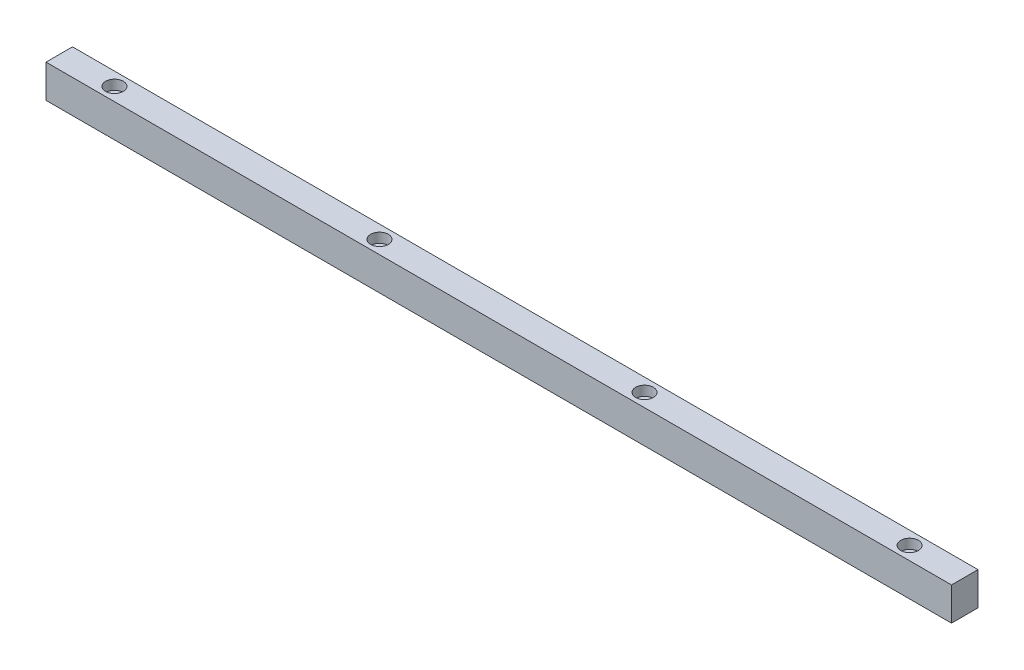
ISO-10303-21;
HEADER;
FILE_DESCRIPTION(('STEP AP214'),'2;1');
FILE_NAME('part.step','',(''),(''),'','','');
FILE_SCHEMA(('AUTOMOTIVE_DESIGN { 1 0 10303 214 1 1 1 1 }'));
ENDSEC;
DATA;
#1=APPLICATION_CONTEXT('core data for automotive mechanical design processes');
#2=APPLICATION_PROTOCOL_DEFINITION('international standard','automotive_design',2000,#1);
#3=PRODUCT_CONTEXT('',#1,'mechanical');
#4=PRODUCT('Part','Part','',(#3));
#5=PRODUCT_RELATED_PRODUCT_CATEGORY('part','',(#4));
#6=PRODUCT_DEFINITION_FORMATION('','',#4);
#7=PRODUCT_DEFINITION_CONTEXT('part definition',#1,'design');
#8=PRODUCT_DEFINITION('design','',#6,#7);
#9=PRODUCT_DEFINITION_SHAPE('','',#8);
#10=(LENGTH_UNIT() NAMED_UNIT(*) SI_UNIT(.MILLI.,.METRE.));
#11=(NAMED_UNIT(*) PLANE_ANGLE_UNIT() SI_UNIT($,.RADIAN.));
#12=(NAMED_UNIT(*) SI_UNIT($,.STERADIAN.) SOLID_ANGLE_UNIT());
#13=UNCERTAINTY_MEASURE_WITH_UNIT(LENGTH_MEASURE(1.E-05),#10,'distance_accuracy_value','');
#14=(GEOMETRIC_REPRESENTATION_CONTEXT(3) GLOBAL_UNCERTAINTY_ASSIGNED_CONTEXT((#13)) GLOBAL_UNIT_ASSIGNED_CONTEXT((#10,
#11,#12)) REPRESENTATION_CONTEXT('',''));
#15=CARTESIAN_POINT('',(0.,0.,0.));
#16=DIRECTION('',(0.,0.,1.));
#17=DIRECTION('',(1.,0.,0.));
#18=AXIS2_PLACEMENT_3D('',#15,#16,#17);
#19=CARTESIAN_POINT('',(205.,15.,-6.));
#20=DIRECTION('',(-1.,0.,0.));
#21=DIRECTION('',(0.,0.,1.));
#22=AXIS2_PLACEMENT_3D('',#19,#20,#21);
#23=PLANE('',#22);
#24=DIRECTION('',(0.,0.,-1.));
#25=VECTOR('',#24,1.);
#26=CARTESIAN_POINT('',(205.,0.,-6.));
#27=LINE('',#26,#25);
#28=CARTESIAN_POINT('',(205.,0.,6.));
#29=VERTEX_POINT('',#28);
#30=CARTESIAN_POINT('',(205.,0.,-6.));
#31=VERTEX_POINT('',#30);
#32=EDGE_CURVE('E102',#29,#31,#27,.T.);
#33=ORIENTED_EDGE('',*,*,#32,.T.);
#34=DIRECTION('',(0.,-1.,0.));
#35=VECTOR('',#34,1.);
#36=CARTESIAN_POINT('',(205.,15.,-6.));
#37=LINE('',#36,#35);
#38=CARTESIAN_POINT('',(205.,15.,-6.));
#39=VERTEX_POINT('',#38);
#40=EDGE_CURVE('E11',#39,#31,#37,.T.);
#41=ORIENTED_EDGE('',*,*,#40,.F.);
#42=DIRECTION('',(0.,0.,-1.));
#43=VECTOR('',#42,1.);
#44=CARTESIAN_POINT('',(205.,15.,-6.));
#45=LINE('',#44,#43);
#46=CARTESIAN_POINT('',(205.,15.,6.));
#47=VERTEX_POINT('',#46);
#48=EDGE_CURVE('E90',#47,#39,#45,.T.);
#49=ORIENTED_EDGE('',*,*,#48,.F.);
#50=DIRECTION('',(0.,-1.,0.));
#51=VECTOR('',#50,1.);
#52=CARTESIAN_POINT('',(205.,15.,6.));
#53=LINE('',#52,#51);
#54=EDGE_CURVE('E98',#47,#29,#53,.T.);
#55=ORIENTED_EDGE('',*,*,#54,.T.);
#56=EDGE_LOOP('',(#33,#41,#49,#55));
#57=FACE_BOUND('',#56,.T.);
#58=ADVANCED_FACE('F39',(#57),#23,.F.);
#59=CARTESIAN_POINT('',(-205.,15.,-6.));
#60=DIRECTION('',(0.,0.,1.));
#61=DIRECTION('',(1.,0.,0.));
#62=AXIS2_PLACEMENT_3D('',#59,#60,#61);
#63=PLANE('',#62);
#64=DIRECTION('',(-1.,0.,0.));
#65=VECTOR('',#64,1.);
#66=CARTESIAN_POINT('',(-205.,0.,-6.));
#67=LINE('',#66,#65);
#68=CARTESIAN_POINT('',(-205.,0.,-6.));
#69=VERTEX_POINT('',#68);
#70=EDGE_CURVE('E94',#31,#69,#67,.T.);
#71=ORIENTED_EDGE('',*,*,#70,.T.);
#72=DIRECTION('',(0.,-1.,0.));
#73=VECTOR('',#72,1.);
#74=CARTESIAN_POINT('',(-205.,15.,-6.));
#75=LINE('',#74,#73);
#76=CARTESIAN_POINT('',(-205.,15.,-6.));
#77=VERTEX_POINT('',#76);
#78=EDGE_CURVE('E47',#77,#69,#75,.T.);
#79=ORIENTED_EDGE('',*,*,#78,.F.);
#80=DIRECTION('',(-1.,0.,0.));
#81=VECTOR('',#80,1.);
#82=CARTESIAN_POINT('',(-205.,15.,-6.));
#83=LINE('',#82,#81);
#84=EDGE_CURVE('E85',#39,#77,#83,.T.);
#85=ORIENTED_EDGE('',*,*,#84,.F.);
#86=ORIENTED_EDGE('',*,*,#40,.T.);
#87=EDGE_LOOP('',(#71,#79,#85,#86));
#88=FACE_BOUND('',#87,.T.);
#89=ADVANCED_FACE('F93',(#88),#63,.F.);
#90=CARTESIAN_POINT('',(-205.,15.,-6.));
#91=DIRECTION('',(1.,0.,0.));
#92=DIRECTION('',(0.,0.,-1.));
#93=AXIS2_PLACEMENT_3D('',#90,#91,#92);
#94=PLANE('',#93);
#95=DIRECTION('',(0.,0.,1.));
#96=VECTOR('',#95,1.);
#97=CARTESIAN_POINT('',(-205.,0.,-6.));
#98=LINE('',#97,#96);
#99=CARTESIAN_POINT('',(-205.,0.,6.));
#100=VERTEX_POINT('',#99);
#101=EDGE_CURVE('E72',#69,#100,#98,.T.);
#102=ORIENTED_EDGE('',*,*,#101,.T.);
#103=DIRECTION('',(0.,-1.,0.));
#104=VECTOR('',#103,1.);
#105=CARTESIAN_POINT('',(-205.,15.,6.));
#106=LINE('',#105,#104);
#107=CARTESIAN_POINT('',(-205.,15.,6.));
#108=VERTEX_POINT('',#107);
#109=EDGE_CURVE('E95',#108,#100,#106,.T.);
#110=ORIENTED_EDGE('',*,*,#109,.F.);
#111=DIRECTION('',(0.,0.,1.));
#112=VECTOR('',#111,1.);
#113=CARTESIAN_POINT('',(-205.,15.,-6.));
#114=LINE('',#113,#112);
#115=EDGE_CURVE('E88',#77,#108,#114,.T.);
#116=ORIENTED_EDGE('',*,*,#115,.F.);
#117=ORIENTED_EDGE('',*,*,#78,.T.);
#118=EDGE_LOOP('',(#102,#110,#116,#117));
#119=FACE_BOUND('',#118,.T.);
#120=ADVANCED_FACE('F96',(#119),#94,.F.);
#121=CARTESIAN_POINT('',(-205.,15.,6.));
#122=DIRECTION('',(0.,0.,-1.));
#123=DIRECTION('',(-1.,0.,0.));
#124=AXIS2_PLACEMENT_3D('',#121,#122,#123);
#125=PLANE('',#124);
#126=DIRECTION('',(1.,0.,0.));
#127=VECTOR('',#126,1.);
#128=CARTESIAN_POINT('',(-205.,0.,6.));
#129=LINE('',#128,#127);
#130=EDGE_CURVE('E78',#100,#29,#129,.T.);
#131=ORIENTED_EDGE('',*,*,#130,.T.);
#132=ORIENTED_EDGE('',*,*,#54,.F.);
#133=DIRECTION('',(1.,0.,0.));
#134=VECTOR('',#133,1.);
#135=CARTESIAN_POINT('',(-205.,15.,6.));
#136=LINE('',#135,#134);
#137=EDGE_CURVE('E55',#108,#47,#136,.T.);
#138=ORIENTED_EDGE('',*,*,#137,.F.);
#139=ORIENTED_EDGE('',*,*,#109,.T.);
#140=EDGE_LOOP('',(#131,#132,#138,#139));
#141=FACE_BOUND('',#140,.T.);
#142=ADVANCED_FACE('F110',(#141),#125,.F.);
#143=CARTESIAN_POINT('',(0.,15.,0.));
#144=DIRECTION('',(0.,1.,0.));
#145=DIRECTION('',(0.,0.,1.));
#146=AXIS2_PLACEMENT_3D('',#143,#144,#145);
#147=PLANE('',#146);
#148=CARTESIAN_POINT('',(-60.,15.,0.));
#149=DIRECTION('',(0.,1.,0.));
#150=DIRECTION('',(0.,0.,1.));
#151=AXIS2_PLACEMENT_3D('',#148,#149,#150);
#152=CIRCLE('',#151,3.99999999999999);
#153=CARTESIAN_POINT('',(-60.,15.,3.99999999999999));
#154=VERTEX_POINT('',#153);
#155=EDGE_CURVE('E160',#154,#154,#152,.T.);
#156=ORIENTED_EDGE('',*,*,#155,.F.);
#157=EDGE_LOOP('',(#156));
#158=FACE_BOUND('',#157,.T.);
#159=CARTESIAN_POINT('',(-180.,15.,0.));
#160=DIRECTION('',(0.,1.,0.));
#161=DIRECTION('',(0.,0.,1.));
#162=AXIS2_PLACEMENT_3D('',#159,#160,#161);
#163=CIRCLE('',#162,4.);
#164=CARTESIAN_POINT('',(-180.,15.,4.));
#165=VERTEX_POINT('',#164);
#166=EDGE_CURVE('E148',#165,#165,#163,.T.);
#167=ORIENTED_EDGE('',*,*,#166,.F.);
#168=EDGE_LOOP('',(#167));
#169=FACE_BOUND('',#168,.T.);
#170=CARTESIAN_POINT('',(180.,15.,-3.19189119579733E-13));
#171=DIRECTION('',(0.,1.,0.));
#172=DIRECTION('',(0.,0.,1.));
#173=AXIS2_PLACEMENT_3D('',#170,#171,#172);
#174=CIRCLE('',#173,4.);
#175=CARTESIAN_POINT('',(180.,15.,3.99999999999968));
#176=VERTEX_POINT('',#175);
#177=EDGE_CURVE('E136',#176,#176,#174,.T.);
#178=ORIENTED_EDGE('',*,*,#177,.F.);
#179=EDGE_LOOP('',(#178));
#180=FACE_BOUND('',#179,.T.);
#181=CARTESIAN_POINT('',(60.0000000000001,15.,-1.05818132034585E-13));
#182=DIRECTION('',(0.,1.,0.));
#183=DIRECTION('',(0.,0.,1.));
#184=AXIS2_PLACEMENT_3D('',#181,#182,#183);
#185=CIRCLE('',#184,3.99999999999999);
#186=CARTESIAN_POINT('',(60.0000000000001,15.,3.99999999999988));
#187=VERTEX_POINT('',#186);
#188=EDGE_CURVE('E124',#187,#187,#185,.T.);
#189=ORIENTED_EDGE('',*,*,#188,.F.);
#190=EDGE_LOOP('',(#189));
#191=FACE_BOUND('',#190,.T.);
#192=ORIENTED_EDGE('',*,*,#48,.T.);
#193=ORIENTED_EDGE('',*,*,#84,.T.);
#194=ORIENTED_EDGE('',*,*,#115,.T.);
#195=ORIENTED_EDGE('',*,*,#137,.T.);
#196=EDGE_LOOP('',(#192,#193,#194,#195));
#197=FACE_BOUND('',#196,.T.);
#198=ADVANCED_FACE('F86',(#158,#169,#180,#191,#197),#147,.T.);
#199=CARTESIAN_POINT('',(0.,0.,0.));
#200=DIRECTION('',(0.,1.,0.));
#201=DIRECTION('',(0.,0.,1.));
#202=AXIS2_PLACEMENT_3D('',#199,#200,#201);
#203=PLANE('',#202);
#204=CARTESIAN_POINT('',(-60.,0.,0.));
#205=DIRECTION('',(0.,1.,0.));
#206=DIRECTION('',(0.,0.,1.));
#207=AXIS2_PLACEMENT_3D('',#204,#205,#206);
#208=CIRCLE('',#207,2.25000000000001);
#209=CARTESIAN_POINT('',(-60.,0.,2.25000000000001));
#210=VERTEX_POINT('',#209);
#211=EDGE_CURVE('E151',#210,#210,#208,.T.);
#212=ORIENTED_EDGE('',*,*,#211,.T.);
#213=EDGE_LOOP('',(#212));
#214=FACE_BOUND('',#213,.T.);
#215=CARTESIAN_POINT('',(-180.,0.,0.));
#216=DIRECTION('',(0.,1.,0.));
#217=DIRECTION('',(0.,0.,1.));
#218=AXIS2_PLACEMENT_3D('',#215,#216,#217);
#219=CIRCLE('',#218,2.25);
#220=CARTESIAN_POINT('',(-180.,0.,2.25));
#221=VERTEX_POINT('',#220);
#222=EDGE_CURVE('E139',#221,#221,#219,.T.);
#223=ORIENTED_EDGE('',*,*,#222,.T.);
#224=EDGE_LOOP('',(#223));
#225=FACE_BOUND('',#224,.T.);
#226=CARTESIAN_POINT('',(180.,0.,-3.19189119579733E-13));
#227=DIRECTION('',(0.,1.,0.));
#228=DIRECTION('',(0.,0.,1.));
#229=AXIS2_PLACEMENT_3D('',#226,#227,#228);
#230=CIRCLE('',#229,2.25);
#231=CARTESIAN_POINT('',(180.,0.,2.24999999999968));
#232=VERTEX_POINT('',#231);
#233=EDGE_CURVE('E127',#232,#232,#230,.T.);
#234=ORIENTED_EDGE('',*,*,#233,.T.);
#235=EDGE_LOOP('',(#234));
#236=FACE_BOUND('',#235,.T.);
#237=CARTESIAN_POINT('',(60.0000000000001,0.,-1.05818132034585E-13));
#238=DIRECTION('',(0.,1.,0.));
#239=DIRECTION('',(0.,0.,1.));
#240=AXIS2_PLACEMENT_3D('',#237,#238,#239);
#241=CIRCLE('',#240,2.25000000000001);
#242=CARTESIAN_POINT('',(60.0000000000001,0.,2.2499999999999));
#243=VERTEX_POINT('',#242);
#244=EDGE_CURVE('E105',#243,#243,#241,.T.);
#245=ORIENTED_EDGE('',*,*,#244,.T.);
#246=EDGE_LOOP('',(#245));
#247=FACE_BOUND('',#246,.T.);
#248=ORIENTED_EDGE('',*,*,#32,.F.);
#249=ORIENTED_EDGE('',*,*,#130,.F.);
#250=ORIENTED_EDGE('',*,*,#101,.F.);
#251=ORIENTED_EDGE('',*,*,#70,.F.);
#252=EDGE_LOOP('',(#248,#249,#250,#251));
#253=FACE_BOUND('',#252,.T.);
#254=ADVANCED_FACE('F113',(#214,#225,#236,#247,#253),#203,.F.);
#255=CARTESIAN_POINT('',(60.0000000000001,15.,-1.05818132034585E-13));
#256=DIRECTION('',(0.,1.,0.));
#257=DIRECTION('',(0.,0.,1.));
#258=AXIS2_PLACEMENT_3D('',#255,#256,#257);
#259=CYLINDRICAL_SURFACE('',#258,2.25000000000001);
#260=ORIENTED_EDGE('',*,*,#244,.F.);
#261=EDGE_LOOP('',(#260));
#262=FACE_BOUND('',#261,.T.);
#263=CARTESIAN_POINT('',(60.0000000000001,10.6,-1.05818132034585E-13));
#264=DIRECTION('',(0.,1.,0.));
#265=DIRECTION('',(0.,0.,1.));
#266=AXIS2_PLACEMENT_3D('',#263,#264,#265);
#267=CIRCLE('',#266,2.25000000000002);
#268=CARTESIAN_POINT('',(60.0000000000001,10.6,2.24999999999991));
#269=VERTEX_POINT('',#268);
#270=EDGE_CURVE('E118',#269,#269,#267,.T.);
#271=ORIENTED_EDGE('',*,*,#270,.T.);
#272=EDGE_LOOP('',(#271));
#273=FACE_BOUND('',#272,.T.);
#274=ADVANCED_FACE('F188',(#262,#273),#259,.F.);
#275=CARTESIAN_POINT('',(62.2500000000001,10.6,-1.05818132034585E-13));
#276=DIRECTION('',(0.,-1.,0.));
#277=DIRECTION('',(0.,0.,-1.));
#278=AXIS2_PLACEMENT_3D('',#275,#276,#277);
#279=PLANE('',#278);
#280=ORIENTED_EDGE('',*,*,#270,.F.);
#281=EDGE_LOOP('',(#280));
#282=FACE_BOUND('',#281,.T.);
#283=CARTESIAN_POINT('',(60.0000000000001,10.6,-1.05818132034585E-13));
#284=DIRECTION('',(0.,1.,0.));
#285=DIRECTION('',(0.,0.,1.));
#286=AXIS2_PLACEMENT_3D('',#283,#284,#285);
#287=CIRCLE('',#286,3.99999999999999);
#288=CARTESIAN_POINT('',(60.0000000000001,10.6,3.99999999999988));
#289=VERTEX_POINT('',#288);
#290=EDGE_CURVE('E121',#289,#289,#287,.T.);
#291=ORIENTED_EDGE('',*,*,#290,.T.);
#292=EDGE_LOOP('',(#291));
#293=FACE_BOUND('',#292,.T.);
#294=ADVANCED_FACE('F178',(#282,#293),#279,.F.);
#295=CARTESIAN_POINT('',(60.0000000000001,15.,-1.05818132034585E-13));
#296=DIRECTION('',(0.,1.,0.));
#297=DIRECTION('',(0.,0.,1.));
#298=AXIS2_PLACEMENT_3D('',#295,#296,#297);
#299=CYLINDRICAL_SURFACE('',#298,3.99999999999999);
#300=ORIENTED_EDGE('',*,*,#290,.F.);
#301=EDGE_LOOP('',(#300));
#302=FACE_BOUND('',#301,.T.);
#303=ORIENTED_EDGE('',*,*,#188,.T.);
#304=EDGE_LOOP('',(#303));
#305=FACE_BOUND('',#304,.T.);
#306=ADVANCED_FACE('F175',(#302,#305),#299,.F.);
#307=CARTESIAN_POINT('',(180.,15.,-3.19189119579733E-13));
#308=DIRECTION('',(0.,1.,0.));
#309=DIRECTION('',(0.,0.,1.));
#310=AXIS2_PLACEMENT_3D('',#307,#308,#309);
#311=CYLINDRICAL_SURFACE('',#310,2.25);
#312=ORIENTED_EDGE('',*,*,#233,.F.);
#313=EDGE_LOOP('',(#312));
#314=FACE_BOUND('',#313,.T.);
#315=CARTESIAN_POINT('',(180.,10.6,-3.19189119579733E-13));
#316=DIRECTION('',(0.,1.,0.));
#317=DIRECTION('',(0.,0.,1.));
#318=AXIS2_PLACEMENT_3D('',#315,#316,#317);
#319=CIRCLE('',#318,2.25);
#320=CARTESIAN_POINT('',(180.,10.6,2.24999999999968));
#321=VERTEX_POINT('',#320);
#322=EDGE_CURVE('E130',#321,#321,#319,.T.);
#323=ORIENTED_EDGE('',*,*,#322,.T.);
#324=EDGE_LOOP('',(#323));
#325=FACE_BOUND('',#324,.T.);
#326=ADVANCED_FACE('F177',(#314,#325),#311,.F.);
#327=CARTESIAN_POINT('',(182.25,10.6,-3.19189119579733E-13));
#328=DIRECTION('',(0.,-1.,0.));
#329=DIRECTION('',(0.,0.,-1.));
#330=AXIS2_PLACEMENT_3D('',#327,#328,#329);
#331=PLANE('',#330);
#332=ORIENTED_EDGE('',*,*,#322,.F.);
#333=EDGE_LOOP('',(#332));
#334=FACE_BOUND('',#333,.T.);
#335=CARTESIAN_POINT('',(180.,10.6,-3.19189119579733E-13));
#336=DIRECTION('',(0.,1.,0.));
#337=DIRECTION('',(0.,0.,1.));
#338=AXIS2_PLACEMENT_3D('',#335,#336,#337);
#339=CIRCLE('',#338,4.);
#340=CARTESIAN_POINT('',(180.,10.6,3.99999999999968));
#341=VERTEX_POINT('',#340);
#342=EDGE_CURVE('E133',#341,#341,#339,.T.);
#343=ORIENTED_EDGE('',*,*,#342,.T.);
#344=EDGE_LOOP('',(#343));
#345=FACE_BOUND('',#344,.T.);
#346=ADVANCED_FACE('F185',(#334,#345),#331,.F.);
#347=CARTESIAN_POINT('',(180.,15.,-3.19189119579733E-13));
#348=DIRECTION('',(0.,1.,0.));
#349=DIRECTION('',(0.,0.,1.));
#350=AXIS2_PLACEMENT_3D('',#347,#348,#349);
#351=CYLINDRICAL_SURFACE('',#350,4.);
#352=ORIENTED_EDGE('',*,*,#342,.F.);
#353=EDGE_LOOP('',(#352));
#354=FACE_BOUND('',#353,.T.);
#355=ORIENTED_EDGE('',*,*,#177,.T.);
#356=EDGE_LOOP('',(#355));
#357=FACE_BOUND('',#356,.T.);
#358=ADVANCED_FACE('F234',(#354,#357),#351,.F.);
#359=CARTESIAN_POINT('',(-180.,15.,0.));
#360=DIRECTION('',(0.,1.,0.));
#361=DIRECTION('',(0.,0.,1.));
#362=AXIS2_PLACEMENT_3D('',#359,#360,#361);
#363=CYLINDRICAL_SURFACE('',#362,2.25);
#364=ORIENTED_EDGE('',*,*,#222,.F.);
#365=EDGE_LOOP('',(#364));
#366=FACE_BOUND('',#365,.T.);
#367=CARTESIAN_POINT('',(-180.,10.6,0.));
#368=DIRECTION('',(0.,1.,0.));
#369=DIRECTION('',(0.,0.,1.));
#370=AXIS2_PLACEMENT_3D('',#367,#368,#369);
#371=CIRCLE('',#370,2.25);
#372=CARTESIAN_POINT('',(-180.,10.6,2.25));
#373=VERTEX_POINT('',#372);
#374=EDGE_CURVE('E142',#373,#373,#371,.T.);
#375=ORIENTED_EDGE('',*,*,#374,.T.);
#376=EDGE_LOOP('',(#375));
#377=FACE_BOUND('',#376,.T.);
#378=ADVANCED_FACE('F242',(#366,#377),#363,.F.);
#379=CARTESIAN_POINT('',(-177.75,10.6,0.));
#380=DIRECTION('',(0.,-1.,0.));
#381=DIRECTION('',(0.,0.,-1.));
#382=AXIS2_PLACEMENT_3D('',#379,#380,#381);
#383=PLANE('',#382);
#384=ORIENTED_EDGE('',*,*,#374,.F.);
#385=EDGE_LOOP('',(#384));
#386=FACE_BOUND('',#385,.T.);
#387=CARTESIAN_POINT('',(-180.,10.6,0.));
#388=DIRECTION('',(0.,1.,0.));
#389=DIRECTION('',(0.,0.,1.));
#390=AXIS2_PLACEMENT_3D('',#387,#388,#389);
#391=CIRCLE('',#390,4.);
#392=CARTESIAN_POINT('',(-180.,10.6,4.));
#393=VERTEX_POINT('',#392);
#394=EDGE_CURVE('E145',#393,#393,#391,.T.);
#395=ORIENTED_EDGE('',*,*,#394,.T.);
#396=EDGE_LOOP('',(#395));
#397=FACE_BOUND('',#396,.T.);
#398=ADVANCED_FACE('F250',(#386,#397),#383,.F.);
#399=CARTESIAN_POINT('',(-180.,15.,0.));
#400=DIRECTION('',(0.,1.,0.));
#401=DIRECTION('',(0.,0.,1.));
#402=AXIS2_PLACEMENT_3D('',#399,#400,#401);
#403=CYLINDRICAL_SURFACE('',#402,4.);
#404=ORIENTED_EDGE('',*,*,#394,.F.);
#405=EDGE_LOOP('',(#404));
#406=FACE_BOUND('',#405,.T.);
#407=ORIENTED_EDGE('',*,*,#166,.T.);
#408=EDGE_LOOP('',(#407));
#409=FACE_BOUND('',#408,.T.);
#410=ADVANCED_FACE('F258',(#406,#409),#403,.F.);
#411=CARTESIAN_POINT('',(-60.,15.,0.));
#412=DIRECTION('',(0.,1.,0.));
#413=DIRECTION('',(0.,0.,1.));
#414=AXIS2_PLACEMENT_3D('',#411,#412,#413);
#415=CYLINDRICAL_SURFACE('',#414,2.25000000000001);
#416=ORIENTED_EDGE('',*,*,#211,.F.);
#417=EDGE_LOOP('',(#416));
#418=FACE_BOUND('',#417,.T.);
#419=CARTESIAN_POINT('',(-60.,10.6,0.));
#420=DIRECTION('',(0.,1.,0.));
#421=DIRECTION('',(0.,0.,1.));
#422=AXIS2_PLACEMENT_3D('',#419,#420,#421);
#423=CIRCLE('',#422,2.25000000000002);
#424=CARTESIAN_POINT('',(-60.,10.6,2.25000000000002));
#425=VERTEX_POINT('',#424);
#426=EDGE_CURVE('E154',#425,#425,#423,.T.);
#427=ORIENTED_EDGE('',*,*,#426,.T.);
#428=EDGE_LOOP('',(#427));
#429=FACE_BOUND('',#428,.T.);
#430=ADVANCED_FACE('F266',(#418,#429),#415,.F.);
#431=CARTESIAN_POINT('',(-57.75,10.6,0.));
#432=DIRECTION('',(0.,-1.,0.));
#433=DIRECTION('',(0.,0.,-1.));
#434=AXIS2_PLACEMENT_3D('',#431,#432,#433);
#435=PLANE('',#434);
#436=ORIENTED_EDGE('',*,*,#426,.F.);
#437=EDGE_LOOP('',(#436));
#438=FACE_BOUND('',#437,.T.);
#439=CARTESIAN_POINT('',(-60.,10.6,0.));
#440=DIRECTION('',(0.,1.,0.));
#441=DIRECTION('',(0.,0.,1.));
#442=AXIS2_PLACEMENT_3D('',#439,#440,#441);
#443=CIRCLE('',#442,3.99999999999999);
#444=CARTESIAN_POINT('',(-60.,10.6,3.99999999999999));
#445=VERTEX_POINT('',#444);
#446=EDGE_CURVE('E157',#445,#445,#443,.T.);
#447=ORIENTED_EDGE('',*,*,#446,.T.);
#448=EDGE_LOOP('',(#447));
#449=FACE_BOUND('',#448,.T.);
#450=ADVANCED_FACE('F274',(#438,#449),#435,.F.);
#451=CARTESIAN_POINT('',(-60.,15.,0.));
#452=DIRECTION('',(0.,1.,0.));
#453=DIRECTION('',(0.,0.,1.));
#454=AXIS2_PLACEMENT_3D('',#451,#452,#453);
#455=CYLINDRICAL_SURFACE('',#454,3.99999999999999);
#456=ORIENTED_EDGE('',*,*,#446,.F.);
#457=EDGE_LOOP('',(#456));
#458=FACE_BOUND('',#457,.T.);
#459=ORIENTED_EDGE('',*,*,#155,.T.);
#460=EDGE_LOOP('',(#459));
#461=FACE_BOUND('',#460,.T.);
#462=ADVANCED_FACE('F164',(#458,#461),#455,.F.);
#463=CLOSED_SHELL('',(#58,#89,#120,#142,#198,#254,#274,#294,#306,#326,#346,#358,#378,#398,#410,
#430,#450,#462));
#464=MANIFOLD_SOLID_BREP('B2',#463);
#465=ADVANCED_BREP_SHAPE_REPRESENTATION('',(#18,#464),#14);
#466=SHAPE_DEFINITION_REPRESENTATION(#9,#465);
ENDSEC;
END-ISO-10303-21;
